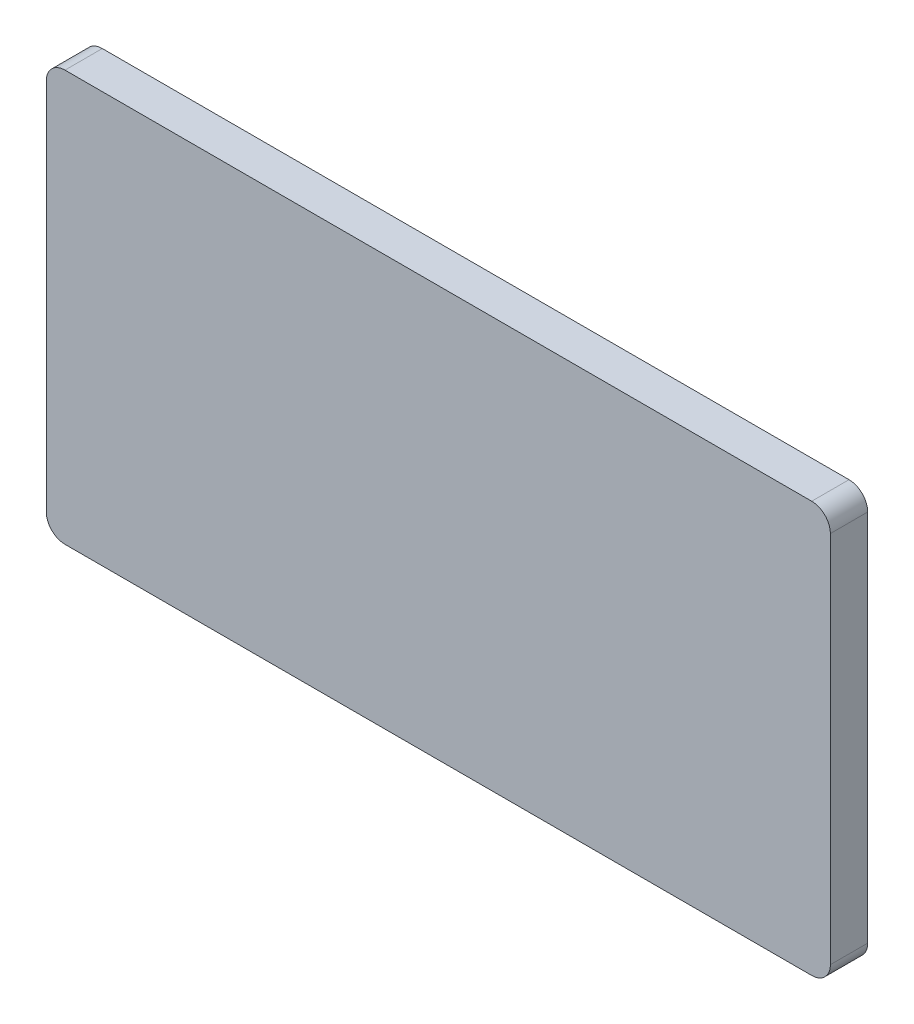
ISO-10303-21;
HEADER;
FILE_DESCRIPTION(('STEP AP214'),'2;1');
FILE_NAME('part.step','',(''),(''),'','','');
FILE_SCHEMA(('AUTOMOTIVE_DESIGN { 1 0 10303 214 1 1 1 1 }'));
ENDSEC;
DATA;
#1=APPLICATION_CONTEXT('core data for automotive mechanical design processes');
#2=APPLICATION_PROTOCOL_DEFINITION('international standard','automotive_design',2000,#1);
#3=PRODUCT_CONTEXT('',#1,'mechanical');
#4=PRODUCT('Part','Part','',(#3));
#5=PRODUCT_RELATED_PRODUCT_CATEGORY('part','',(#4));
#6=PRODUCT_DEFINITION_FORMATION('','',#4);
#7=PRODUCT_DEFINITION_CONTEXT('part definition',#1,'design');
#8=PRODUCT_DEFINITION('design','',#6,#7);
#9=PRODUCT_DEFINITION_SHAPE('','',#8);
#10=(LENGTH_UNIT() NAMED_UNIT(*) SI_UNIT(.MILLI.,.METRE.));
#11=(NAMED_UNIT(*) PLANE_ANGLE_UNIT() SI_UNIT($,.RADIAN.));
#12=(NAMED_UNIT(*) SI_UNIT($,.STERADIAN.) SOLID_ANGLE_UNIT());
#13=UNCERTAINTY_MEASURE_WITH_UNIT(LENGTH_MEASURE(1.E-05),#10,'distance_accuracy_value','');
#14=(GEOMETRIC_REPRESENTATION_CONTEXT(3) GLOBAL_UNCERTAINTY_ASSIGNED_CONTEXT((#13)) GLOBAL_UNIT_ASSIGNED_CONTEXT((#10,
#11,#12)) REPRESENTATION_CONTEXT('',''));
#15=CARTESIAN_POINT('',(0.,0.,0.));
#16=DIRECTION('',(0.,0.,1.));
#17=DIRECTION('',(1.,0.,0.));
#18=AXIS2_PLACEMENT_3D('',#15,#16,#17);
#19=CARTESIAN_POINT('',(-41.3946459412781,-24.3955094991364,5.));
#20=DIRECTION('',(0.,0.,-1.));
#21=DIRECTION('',(-1.,0.,0.));
#22=AXIS2_PLACEMENT_3D('',#19,#20,#21);
#23=CYLINDRICAL_SURFACE('',#22,2.5);
#24=CARTESIAN_POINT('',(-41.3946459412781,-24.3955094991364,0.));
#25=DIRECTION('',(0.,0.,1.));
#26=DIRECTION('',(1.,0.,0.));
#27=AXIS2_PLACEMENT_3D('',#24,#25,#26);
#28=CIRCLE('',#27,2.5);
#29=CARTESIAN_POINT('',(-43.8946459412781,-24.3955094991364,0.));
#30=VERTEX_POINT('',#29);
#31=CARTESIAN_POINT('',(-41.3946459412781,-26.8955094991364,0.));
#32=VERTEX_POINT('',#31);
#33=EDGE_CURVE('E140',#30,#32,#28,.T.);
#34=ORIENTED_EDGE('',*,*,#33,.T.);
#35=DIRECTION('',(0.,0.,-1.));
#36=VECTOR('',#35,1.);
#37=CARTESIAN_POINT('',(-41.3946459412781,-26.8955094991364,5.));
#38=LINE('',#37,#36);
#39=CARTESIAN_POINT('',(-41.3946459412781,-26.8955094991364,5.));
#40=VERTEX_POINT('',#39);
#41=EDGE_CURVE('E11',#40,#32,#38,.T.);
#42=ORIENTED_EDGE('',*,*,#41,.F.);
#43=CARTESIAN_POINT('',(-41.3946459412781,-24.3955094991364,5.));
#44=DIRECTION('',(0.,0.,1.));
#45=DIRECTION('',(1.,0.,0.));
#46=AXIS2_PLACEMENT_3D('',#43,#44,#45);
#47=CIRCLE('',#46,2.5);
#48=CARTESIAN_POINT('',(-43.8946459412781,-24.3955094991364,5.));
#49=VERTEX_POINT('',#48);
#50=EDGE_CURVE('E162',#49,#40,#47,.T.);
#51=ORIENTED_EDGE('',*,*,#50,.F.);
#52=DIRECTION('',(0.,0.,-1.));
#53=VECTOR('',#52,1.);
#54=CARTESIAN_POINT('',(-43.8946459412781,-24.3955094991364,5.));
#55=LINE('',#54,#53);
#56=EDGE_CURVE('E136',#49,#30,#55,.T.);
#57=ORIENTED_EDGE('',*,*,#56,.T.);
#58=EDGE_LOOP('',(#34,#42,#51,#57));
#59=FACE_BOUND('',#58,.T.);
#60=ADVANCED_FACE('F39',(#59),#23,.T.);
#61=CARTESIAN_POINT('',(-41.3946459412781,-26.8955094991364,5.));
#62=DIRECTION('',(0.,1.,0.));
#63=DIRECTION('',(0.,0.,1.));
#64=AXIS2_PLACEMENT_3D('',#61,#62,#63);
#65=PLANE('',#64);
#66=DIRECTION('',(1.,0.,0.));
#67=VECTOR('',#66,1.);
#68=CARTESIAN_POINT('',(-41.3946459412781,-26.8955094991364,0.));
#69=LINE('',#68,#67);
#70=CARTESIAN_POINT('',(58.6053540587219,-26.8955094991364,0.));
#71=VERTEX_POINT('',#70);
#72=EDGE_CURVE('E144',#32,#71,#69,.T.);
#73=ORIENTED_EDGE('',*,*,#72,.T.);
#74=DIRECTION('',(0.,0.,-1.));
#75=VECTOR('',#74,1.);
#76=CARTESIAN_POINT('',(58.6053540587219,-26.8955094991364,5.));
#77=LINE('',#76,#75);
#78=CARTESIAN_POINT('',(58.6053540587219,-26.8955094991364,5.));
#79=VERTEX_POINT('',#78);
#80=EDGE_CURVE('E48',#79,#71,#77,.T.);
#81=ORIENTED_EDGE('',*,*,#80,.F.);
#82=DIRECTION('',(1.,0.,0.));
#83=VECTOR('',#82,1.);
#84=CARTESIAN_POINT('',(-41.3946459412781,-26.8955094991364,5.));
#85=LINE('',#84,#83);
#86=EDGE_CURVE('E99',#40,#79,#85,.T.);
#87=ORIENTED_EDGE('',*,*,#86,.F.);
#88=ORIENTED_EDGE('',*,*,#41,.T.);
#89=EDGE_LOOP('',(#73,#81,#87,#88));
#90=FACE_BOUND('',#89,.T.);
#91=ADVANCED_FACE('F208',(#90),#65,.F.);
#92=CARTESIAN_POINT('',(58.6053540587219,-24.3955094991364,5.));
#93=DIRECTION('',(0.,0.,-1.));
#94=DIRECTION('',(-1.,0.,0.));
#95=AXIS2_PLACEMENT_3D('',#92,#93,#94);
#96=CYLINDRICAL_SURFACE('',#95,2.5);
#97=CARTESIAN_POINT('',(58.6053540587219,-24.3955094991364,0.));
#98=DIRECTION('',(0.,0.,1.));
#99=DIRECTION('',(1.,0.,0.));
#100=AXIS2_PLACEMENT_3D('',#97,#98,#99);
#101=CIRCLE('',#100,2.5);
#102=CARTESIAN_POINT('',(61.1053540587219,-24.3955094991364,0.));
#103=VERTEX_POINT('',#102);
#104=EDGE_CURVE('E147',#71,#103,#101,.T.);
#105=ORIENTED_EDGE('',*,*,#104,.T.);
#106=DIRECTION('',(0.,0.,-1.));
#107=VECTOR('',#106,1.);
#108=CARTESIAN_POINT('',(61.1053540587219,-24.3955094991364,5.));
#109=LINE('',#108,#107);
#110=CARTESIAN_POINT('',(61.1053540587219,-24.3955094991364,5.));
#111=VERTEX_POINT('',#110);
#112=EDGE_CURVE('E173',#111,#103,#109,.T.);
#113=ORIENTED_EDGE('',*,*,#112,.F.);
#114=CARTESIAN_POINT('',(58.6053540587219,-24.3955094991364,5.));
#115=DIRECTION('',(0.,0.,1.));
#116=DIRECTION('',(1.,0.,0.));
#117=AXIS2_PLACEMENT_3D('',#114,#115,#116);
#118=CIRCLE('',#117,2.5);
#119=EDGE_CURVE('E183',#79,#111,#118,.T.);
#120=ORIENTED_EDGE('',*,*,#119,.F.);
#121=ORIENTED_EDGE('',*,*,#80,.T.);
#122=EDGE_LOOP('',(#105,#113,#120,#121));
#123=FACE_BOUND('',#122,.T.);
#124=ADVANCED_FACE('F181',(#123),#96,.T.);
#125=CARTESIAN_POINT('',(61.1053540587219,25.6044905008636,5.));
#126=DIRECTION('',(-1.,0.,0.));
#127=DIRECTION('',(0.,0.,1.));
#128=AXIS2_PLACEMENT_3D('',#125,#126,#127);
#129=PLANE('',#128);
#130=DIRECTION('',(0.,1.,0.));
#131=VECTOR('',#130,1.);
#132=CARTESIAN_POINT('',(61.1053540587219,25.6044905008636,0.));
#133=LINE('',#132,#131);
#134=CARTESIAN_POINT('',(61.1053540587219,25.6044905008636,0.));
#135=VERTEX_POINT('',#134);
#136=EDGE_CURVE('E150',#103,#135,#133,.T.);
#137=ORIENTED_EDGE('',*,*,#136,.T.);
#138=DIRECTION('',(0.,0.,-1.));
#139=VECTOR('',#138,1.);
#140=CARTESIAN_POINT('',(61.1053540587219,25.6044905008636,5.));
#141=LINE('',#140,#139);
#142=CARTESIAN_POINT('',(61.1053540587219,25.6044905008636,5.));
#143=VERTEX_POINT('',#142);
#144=EDGE_CURVE('E169',#143,#135,#141,.T.);
#145=ORIENTED_EDGE('',*,*,#144,.F.);
#146=DIRECTION('',(0.,1.,0.));
#147=VECTOR('',#146,1.);
#148=CARTESIAN_POINT('',(61.1053540587219,25.6044905008636,5.));
#149=LINE('',#148,#147);
#150=EDGE_CURVE('E196',#111,#143,#149,.T.);
#151=ORIENTED_EDGE('',*,*,#150,.F.);
#152=ORIENTED_EDGE('',*,*,#112,.T.);
#153=EDGE_LOOP('',(#137,#145,#151,#152));
#154=FACE_BOUND('',#153,.T.);
#155=ADVANCED_FACE('F191',(#154),#129,.F.);
#156=CARTESIAN_POINT('',(58.6053540587219,25.6044905008636,5.));
#157=DIRECTION('',(0.,0.,-1.));
#158=DIRECTION('',(-1.,0.,0.));
#159=AXIS2_PLACEMENT_3D('',#156,#157,#158);
#160=CYLINDRICAL_SURFACE('',#159,2.5);
#161=CARTESIAN_POINT('',(58.6053540587219,25.6044905008636,0.));
#162=DIRECTION('',(0.,0.,1.));
#163=DIRECTION('',(1.,0.,0.));
#164=AXIS2_PLACEMENT_3D('',#161,#162,#163);
#165=CIRCLE('',#164,2.5);
#166=CARTESIAN_POINT('',(58.6053540587219,28.1044905008636,0.));
#167=VERTEX_POINT('',#166);
#168=EDGE_CURVE('E153',#135,#167,#165,.T.);
#169=ORIENTED_EDGE('',*,*,#168,.T.);
#170=DIRECTION('',(0.,0.,-1.));
#171=VECTOR('',#170,1.);
#172=CARTESIAN_POINT('',(58.6053540587219,28.1044905008636,5.));
#173=LINE('',#172,#171);
#174=CARTESIAN_POINT('',(58.6053540587219,28.1044905008636,5.));
#175=VERTEX_POINT('',#174);
#176=EDGE_CURVE('E129',#175,#167,#173,.T.);
#177=ORIENTED_EDGE('',*,*,#176,.F.);
#178=CARTESIAN_POINT('',(58.6053540587219,25.6044905008636,5.));
#179=DIRECTION('',(0.,0.,1.));
#180=DIRECTION('',(1.,0.,0.));
#181=AXIS2_PLACEMENT_3D('',#178,#179,#180);
#182=CIRCLE('',#181,2.5);
#183=EDGE_CURVE('E118',#143,#175,#182,.T.);
#184=ORIENTED_EDGE('',*,*,#183,.F.);
#185=ORIENTED_EDGE('',*,*,#144,.T.);
#186=EDGE_LOOP('',(#169,#177,#184,#185));
#187=FACE_BOUND('',#186,.T.);
#188=ADVANCED_FACE('F194',(#187),#160,.T.);
#189=CARTESIAN_POINT('',(-41.3946459412781,28.1044905008636,5.));
#190=DIRECTION('',(0.,-1.,0.));
#191=DIRECTION('',(0.,0.,-1.));
#192=AXIS2_PLACEMENT_3D('',#189,#190,#191);
#193=PLANE('',#192);
#194=DIRECTION('',(-1.,0.,0.));
#195=VECTOR('',#194,1.);
#196=CARTESIAN_POINT('',(-41.3946459412781,28.1044905008636,0.));
#197=LINE('',#196,#195);
#198=CARTESIAN_POINT('',(-41.3946459412781,28.1044905008636,0.));
#199=VERTEX_POINT('',#198);
#200=EDGE_CURVE('E127',#167,#199,#197,.T.);
#201=ORIENTED_EDGE('',*,*,#200,.T.);
#202=DIRECTION('',(0.,0.,-1.));
#203=VECTOR('',#202,1.);
#204=CARTESIAN_POINT('',(-41.3946459412781,28.1044905008636,5.));
#205=LINE('',#204,#203);
#206=CARTESIAN_POINT('',(-41.3946459412781,28.1044905008636,5.));
#207=VERTEX_POINT('',#206);
#208=EDGE_CURVE('E124',#207,#199,#205,.T.);
#209=ORIENTED_EDGE('',*,*,#208,.F.);
#210=DIRECTION('',(-1.,0.,0.));
#211=VECTOR('',#210,1.);
#212=CARTESIAN_POINT('',(-41.3946459412781,28.1044905008636,5.));
#213=LINE('',#212,#211);
#214=EDGE_CURVE('E112',#175,#207,#213,.T.);
#215=ORIENTED_EDGE('',*,*,#214,.F.);
#216=ORIENTED_EDGE('',*,*,#176,.T.);
#217=EDGE_LOOP('',(#201,#209,#215,#216));
#218=FACE_BOUND('',#217,.T.);
#219=ADVANCED_FACE('F125',(#218),#193,.F.);
#220=CARTESIAN_POINT('',(-41.3946459412781,25.6044905008636,5.));
#221=DIRECTION('',(0.,0.,-1.));
#222=DIRECTION('',(-1.,0.,0.));
#223=AXIS2_PLACEMENT_3D('',#220,#221,#222);
#224=CYLINDRICAL_SURFACE('',#223,2.5);
#225=CARTESIAN_POINT('',(-41.3946459412781,25.6044905008636,0.));
#226=DIRECTION('',(0.,0.,1.));
#227=DIRECTION('',(1.,0.,0.));
#228=AXIS2_PLACEMENT_3D('',#225,#226,#227);
#229=CIRCLE('',#228,2.5);
#230=CARTESIAN_POINT('',(-43.8946459412781,25.6044905008636,0.));
#231=VERTEX_POINT('',#230);
#232=EDGE_CURVE('E85',#199,#231,#229,.T.);
#233=ORIENTED_EDGE('',*,*,#232,.T.);
#234=DIRECTION('',(0.,0.,-1.));
#235=VECTOR('',#234,1.);
#236=CARTESIAN_POINT('',(-43.8946459412781,25.6044905008636,5.));
#237=LINE('',#236,#235);
#238=CARTESIAN_POINT('',(-43.8946459412781,25.6044905008636,5.));
#239=VERTEX_POINT('',#238);
#240=EDGE_CURVE('E130',#239,#231,#237,.T.);
#241=ORIENTED_EDGE('',*,*,#240,.F.);
#242=CARTESIAN_POINT('',(-41.3946459412781,25.6044905008636,5.));
#243=DIRECTION('',(0.,0.,1.));
#244=DIRECTION('',(1.,0.,0.));
#245=AXIS2_PLACEMENT_3D('',#242,#243,#244);
#246=CIRCLE('',#245,2.5);
#247=EDGE_CURVE('E116',#207,#239,#246,.T.);
#248=ORIENTED_EDGE('',*,*,#247,.F.);
#249=ORIENTED_EDGE('',*,*,#208,.T.);
#250=EDGE_LOOP('',(#233,#241,#248,#249));
#251=FACE_BOUND('',#250,.T.);
#252=ADVANCED_FACE('F132',(#251),#224,.T.);
#253=CARTESIAN_POINT('',(-43.8946459412781,25.6044905008636,5.));
#254=DIRECTION('',(1.,0.,0.));
#255=DIRECTION('',(0.,1.,0.));
#256=AXIS2_PLACEMENT_3D('',#253,#254,#255);
#257=PLANE('',#256);
#258=DIRECTION('',(0.,-1.,0.));
#259=VECTOR('',#258,1.);
#260=CARTESIAN_POINT('',(-43.8946459412781,25.6044905008636,0.));
#261=LINE('',#260,#259);
#262=EDGE_CURVE('E91',#231,#30,#261,.T.);
#263=ORIENTED_EDGE('',*,*,#262,.T.);
#264=ORIENTED_EDGE('',*,*,#56,.F.);
#265=DIRECTION('',(0.,-1.,0.));
#266=VECTOR('',#265,1.);
#267=CARTESIAN_POINT('',(-43.8946459412781,25.6044905008636,5.));
#268=LINE('',#267,#266);
#269=EDGE_CURVE('E56',#239,#49,#268,.T.);
#270=ORIENTED_EDGE('',*,*,#269,.F.);
#271=ORIENTED_EDGE('',*,*,#240,.T.);
#272=EDGE_LOOP('',(#263,#264,#270,#271));
#273=FACE_BOUND('',#272,.T.);
#274=ADVANCED_FACE('F224',(#273),#257,.F.);
#275=CARTESIAN_POINT('',(-41.3946459412781,-24.3955094991364,5.));
#276=DIRECTION('',(0.,0.,1.));
#277=DIRECTION('',(1.,0.,0.));
#278=AXIS2_PLACEMENT_3D('',#275,#276,#277);
#279=PLANE('',#278);
#280=ORIENTED_EDGE('',*,*,#50,.T.);
#281=ORIENTED_EDGE('',*,*,#86,.T.);
#282=ORIENTED_EDGE('',*,*,#119,.T.);
#283=ORIENTED_EDGE('',*,*,#150,.T.);
#284=ORIENTED_EDGE('',*,*,#183,.T.);
#285=ORIENTED_EDGE('',*,*,#214,.T.);
#286=ORIENTED_EDGE('',*,*,#247,.T.);
#287=ORIENTED_EDGE('',*,*,#269,.T.);
#288=EDGE_LOOP('',(#280,#281,#282,#283,#284,#285,#286,#287));
#289=FACE_BOUND('',#288,.T.);
#290=ADVANCED_FACE('F114',(#289),#279,.T.);
#291=CARTESIAN_POINT('',(-41.3946459412781,-24.3955094991364,0.));
#292=DIRECTION('',(0.,0.,1.));
#293=DIRECTION('',(1.,0.,0.));
#294=AXIS2_PLACEMENT_3D('',#291,#292,#293);
#295=PLANE('',#294);
#296=ORIENTED_EDGE('',*,*,#33,.F.);
#297=ORIENTED_EDGE('',*,*,#262,.F.);
#298=ORIENTED_EDGE('',*,*,#232,.F.);
#299=ORIENTED_EDGE('',*,*,#200,.F.);
#300=ORIENTED_EDGE('',*,*,#168,.F.);
#301=ORIENTED_EDGE('',*,*,#136,.F.);
#302=ORIENTED_EDGE('',*,*,#104,.F.);
#303=ORIENTED_EDGE('',*,*,#72,.F.);
#304=EDGE_LOOP('',(#296,#297,#298,#299,#300,#301,#302,#303));
#305=FACE_BOUND('',#304,.T.);
#306=ADVANCED_FACE('F187',(#305),#295,.F.);
#307=CLOSED_SHELL('',(#60,#91,#124,#155,#188,#219,#252,#274,#290,#306));
#308=MANIFOLD_SOLID_BREP('B2',#307);
#309=ADVANCED_BREP_SHAPE_REPRESENTATION('',(#18,#308),#14);
#310=SHAPE_DEFINITION_REPRESENTATION(#9,#309);
ENDSEC;
END-ISO-10303-21;
